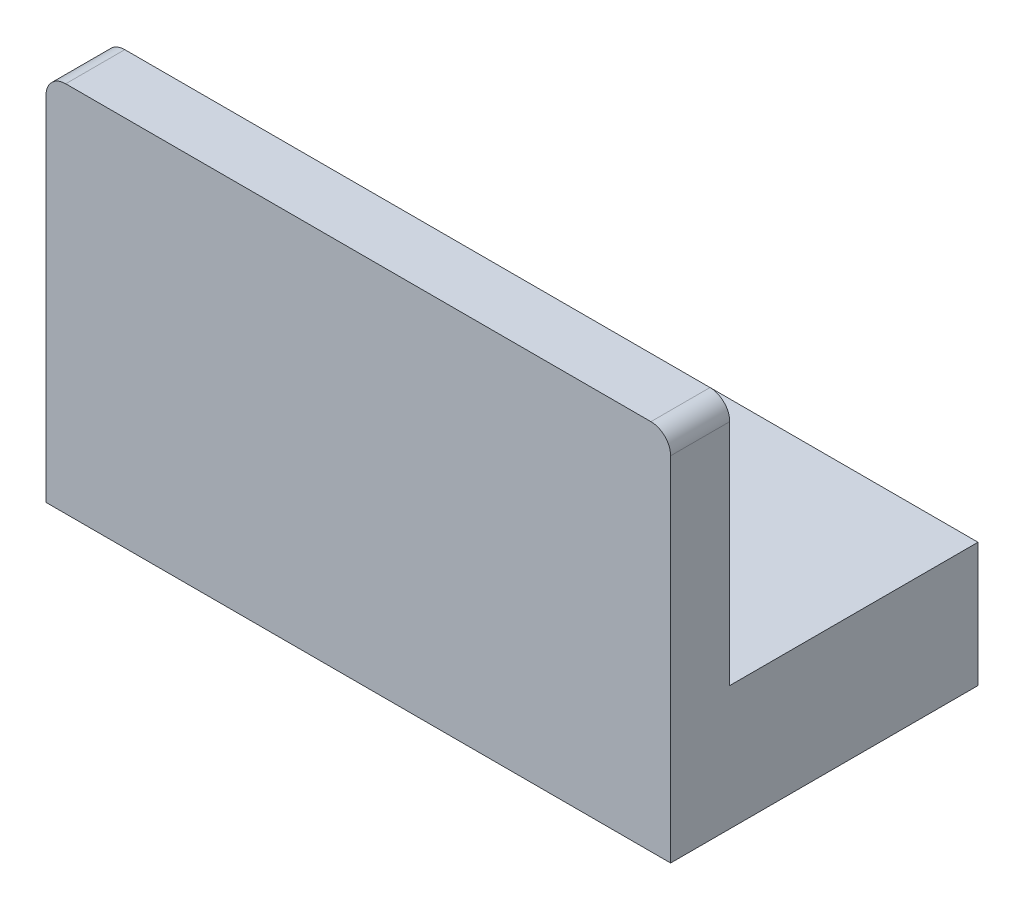
ISO-10303-21;
HEADER;
FILE_DESCRIPTION(('STEP AP214'),'2;1');
FILE_NAME('part.step','',(''),(''),'','','');
FILE_SCHEMA(('AUTOMOTIVE_DESIGN { 1 0 10303 214 1 1 1 1 }'));
ENDSEC;
DATA;
#1=APPLICATION_CONTEXT('core data for automotive mechanical design processes');
#2=APPLICATION_PROTOCOL_DEFINITION('international standard','automotive_design',2000,#1);
#3=PRODUCT_CONTEXT('',#1,'mechanical');
#4=PRODUCT('Part','Part','',(#3));
#5=PRODUCT_RELATED_PRODUCT_CATEGORY('part','',(#4));
#6=PRODUCT_DEFINITION_FORMATION('','',#4);
#7=PRODUCT_DEFINITION_CONTEXT('part definition',#1,'design');
#8=PRODUCT_DEFINITION('design','',#6,#7);
#9=PRODUCT_DEFINITION_SHAPE('','',#8);
#10=(LENGTH_UNIT() NAMED_UNIT(*) SI_UNIT(.MILLI.,.METRE.));
#11=(NAMED_UNIT(*) PLANE_ANGLE_UNIT() SI_UNIT($,.RADIAN.));
#12=(NAMED_UNIT(*) SI_UNIT($,.STERADIAN.) SOLID_ANGLE_UNIT());
#13=UNCERTAINTY_MEASURE_WITH_UNIT(LENGTH_MEASURE(1.E-05),#10,'distance_accuracy_value','');
#14=(GEOMETRIC_REPRESENTATION_CONTEXT(3) GLOBAL_UNCERTAINTY_ASSIGNED_CONTEXT((#13)) GLOBAL_UNIT_ASSIGNED_CONTEXT((#10,
#11,#12)) REPRESENTATION_CONTEXT('',''));
#15=CARTESIAN_POINT('',(0.,0.,0.));
#16=DIRECTION('',(0.,0.,1.));
#17=DIRECTION('',(1.,0.,0.));
#18=AXIS2_PLACEMENT_3D('',#15,#16,#17);
#19=CARTESIAN_POINT('',(-15.85,0.,0.));
#20=DIRECTION('',(0.,-1.,0.));
#21=DIRECTION('',(0.,0.,-1.));
#22=AXIS2_PLACEMENT_3D('',#19,#20,#21);
#23=PLANE('',#22);
#24=DIRECTION('',(0.,0.,-1.));
#25=VECTOR('',#24,1.);
#26=CARTESIAN_POINT('',(0.,0.,0.));
#27=LINE('',#26,#25);
#28=CARTESIAN_POINT('',(0.,0.,0.));
#29=VERTEX_POINT('',#28);
#30=CARTESIAN_POINT('',(0.,0.,-7.8));
#31=VERTEX_POINT('',#30);
#32=EDGE_CURVE('E181',#29,#31,#27,.T.);
#33=ORIENTED_EDGE('',*,*,#32,.F.);
#34=DIRECTION('',(1.,0.,0.));
#35=VECTOR('',#34,1.);
#36=CARTESIAN_POINT('',(-15.85,0.,0.));
#37=LINE('',#36,#35);
#38=CARTESIAN_POINT('',(-15.85,0.,0.));
#39=VERTEX_POINT('',#38);
#40=EDGE_CURVE('E179',#39,#29,#37,.T.);
#41=ORIENTED_EDGE('',*,*,#40,.F.);
#42=DIRECTION('',(0.,0.,-1.));
#43=VECTOR('',#42,1.);
#44=CARTESIAN_POINT('',(-15.85,0.,0.));
#45=LINE('',#44,#43);
#46=CARTESIAN_POINT('',(-15.85,0.,-7.8));
#47=VERTEX_POINT('',#46);
#48=EDGE_CURVE('E167',#39,#47,#45,.T.);
#49=ORIENTED_EDGE('',*,*,#48,.T.);
#50=DIRECTION('',(1.,0.,0.));
#51=VECTOR('',#50,1.);
#52=CARTESIAN_POINT('',(-15.85,0.,-7.8));
#53=LINE('',#52,#51);
#54=EDGE_CURVE('E201',#47,#31,#53,.T.);
#55=ORIENTED_EDGE('',*,*,#54,.T.);
#56=EDGE_LOOP('',(#33,#41,#49,#55));
#57=FACE_BOUND('',#56,.T.);
#58=DIRECTION('',(1.,0.,0.));
#59=VECTOR('',#58,1.);
#60=CARTESIAN_POINT('',(-15.85,0.,-1.55));
#61=LINE('',#60,#59);
#62=CARTESIAN_POINT('',(-14.3,0.,-1.55));
#63=VERTEX_POINT('',#62);
#64=CARTESIAN_POINT('',(-1.55,0.,-1.55));
#65=VERTEX_POINT('',#64);
#66=EDGE_CURVE('E136',#63,#65,#61,.T.);
#67=ORIENTED_EDGE('',*,*,#66,.T.);
#68=DIRECTION('',(0.,0.,-1.));
#69=VECTOR('',#68,1.);
#70=CARTESIAN_POINT('',(-1.55,0.,0.));
#71=LINE('',#70,#69);
#72=CARTESIAN_POINT('',(-1.55,0.,-6.25));
#73=VERTEX_POINT('',#72);
#74=EDGE_CURVE('E159',#65,#73,#71,.T.);
#75=ORIENTED_EDGE('',*,*,#74,.T.);
#76=DIRECTION('',(1.,0.,0.));
#77=VECTOR('',#76,1.);
#78=CARTESIAN_POINT('',(-15.85,0.,-6.25));
#79=LINE('',#78,#77);
#80=CARTESIAN_POINT('',(-14.3,0.,-6.25));
#81=VERTEX_POINT('',#80);
#82=EDGE_CURVE('E146',#81,#73,#79,.T.);
#83=ORIENTED_EDGE('',*,*,#82,.F.);
#84=DIRECTION('',(0.,0.,-1.));
#85=VECTOR('',#84,1.);
#86=CARTESIAN_POINT('',(-14.3,0.,0.));
#87=LINE('',#86,#85);
#88=EDGE_CURVE('E150',#63,#81,#87,.T.);
#89=ORIENTED_EDGE('',*,*,#88,.F.);
#90=EDGE_LOOP('',(#67,#75,#83,#89));
#91=FACE_BOUND('',#90,.T.);
#92=ADVANCED_FACE('F35',(#57,#91),#23,.T.);
#93=CARTESIAN_POINT('',(-15.85,9.45,0.));
#94=DIRECTION('',(0.,0.,1.));
#95=DIRECTION('',(1.,0.,0.));
#96=AXIS2_PLACEMENT_3D('',#93,#94,#95);
#97=PLANE('',#96);
#98=DIRECTION('',(0.,-1.,0.));
#99=VECTOR('',#98,1.);
#100=CARTESIAN_POINT('',(0.,9.45,0.));
#101=LINE('',#100,#99);
#102=CARTESIAN_POINT('',(0.,8.95,0.));
#103=VERTEX_POINT('',#102);
#104=EDGE_CURVE('E164',#103,#29,#101,.T.);
#105=ORIENTED_EDGE('',*,*,#104,.F.);
#106=CARTESIAN_POINT('',(-0.5,8.95,0.));
#107=DIRECTION('',(0.,0.,1.));
#108=DIRECTION('',(1.,0.,0.));
#109=AXIS2_PLACEMENT_3D('',#106,#107,#108);
#110=CIRCLE('',#109,0.5);
#111=CARTESIAN_POINT('',(-0.5,9.45,0.));
#112=VERTEX_POINT('',#111);
#113=EDGE_CURVE('E212',#103,#112,#110,.T.);
#114=ORIENTED_EDGE('',*,*,#113,.T.);
#115=DIRECTION('',(1.,0.,0.));
#116=VECTOR('',#115,1.);
#117=CARTESIAN_POINT('',(-15.85,9.45,0.));
#118=LINE('',#117,#116);
#119=CARTESIAN_POINT('',(-15.35,9.45,0.));
#120=VERTEX_POINT('',#119);
#121=EDGE_CURVE('E192',#120,#112,#118,.T.);
#122=ORIENTED_EDGE('',*,*,#121,.F.);
#123=CARTESIAN_POINT('',(-15.35,8.95,0.));
#124=DIRECTION('',(0.,0.,1.));
#125=DIRECTION('',(1.,0.,0.));
#126=AXIS2_PLACEMENT_3D('',#123,#124,#125);
#127=CIRCLE('',#126,0.5);
#128=CARTESIAN_POINT('',(-15.85,8.95,0.));
#129=VERTEX_POINT('',#128);
#130=EDGE_CURVE('E210',#120,#129,#127,.T.);
#131=ORIENTED_EDGE('',*,*,#130,.T.);
#132=DIRECTION('',(0.,-1.,0.));
#133=VECTOR('',#132,1.);
#134=CARTESIAN_POINT('',(-15.85,9.45,0.));
#135=LINE('',#134,#133);
#136=EDGE_CURVE('E165',#129,#39,#135,.T.);
#137=ORIENTED_EDGE('',*,*,#136,.T.);
#138=ORIENTED_EDGE('',*,*,#40,.T.);
#139=EDGE_LOOP('',(#105,#114,#122,#131,#137,#138));
#140=FACE_BOUND('',#139,.T.);
#141=ADVANCED_FACE('F232',(#140),#97,.T.);
#142=CARTESIAN_POINT('',(-15.85,9.45,-1.5));
#143=DIRECTION('',(0.,1.,0.));
#144=DIRECTION('',(0.,0.,1.));
#145=AXIS2_PLACEMENT_3D('',#142,#143,#144);
#146=PLANE('',#145);
#147=ORIENTED_EDGE('',*,*,#121,.T.);
#148=DIRECTION('',(0.,0.,1.));
#149=VECTOR('',#148,1.);
#150=CARTESIAN_POINT('',(-0.5,9.45,-1.5));
#151=LINE('',#150,#149);
#152=CARTESIAN_POINT('',(-0.5,9.45,-1.5));
#153=VERTEX_POINT('',#152);
#154=EDGE_CURVE('E56',#112,#153,#151,.F.);
#155=ORIENTED_EDGE('',*,*,#154,.T.);
#156=DIRECTION('',(1.,0.,0.));
#157=VECTOR('',#156,1.);
#158=CARTESIAN_POINT('',(-15.85,9.45,-1.5));
#159=LINE('',#158,#157);
#160=CARTESIAN_POINT('',(-15.35,9.45,-1.5));
#161=VERTEX_POINT('',#160);
#162=EDGE_CURVE('E195',#161,#153,#159,.T.);
#163=ORIENTED_EDGE('',*,*,#162,.F.);
#164=DIRECTION('',(0.,0.,1.));
#165=VECTOR('',#164,1.);
#166=CARTESIAN_POINT('',(-15.35,9.45,0.));
#167=LINE('',#166,#165);
#168=EDGE_CURVE('E214',#161,#120,#167,.T.);
#169=ORIENTED_EDGE('',*,*,#168,.T.);
#170=EDGE_LOOP('',(#147,#155,#163,#169));
#171=FACE_BOUND('',#170,.T.);
#172=ADVANCED_FACE('F233',(#171),#146,.T.);
#173=CARTESIAN_POINT('',(-15.85,3.15,-1.5));
#174=DIRECTION('',(0.,0.,-1.));
#175=DIRECTION('',(0.,1.,0.));
#176=AXIS2_PLACEMENT_3D('',#173,#174,#175);
#177=PLANE('',#176);
#178=ORIENTED_EDGE('',*,*,#162,.T.);
#179=CARTESIAN_POINT('',(-0.5,8.95,-1.5));
#180=DIRECTION('',(0.,0.,-1.));
#181=DIRECTION('',(0.,1.,0.));
#182=AXIS2_PLACEMENT_3D('',#179,#180,#181);
#183=CIRCLE('',#182,0.5);
#184=CARTESIAN_POINT('',(0.,8.95,-1.5));
#185=VERTEX_POINT('',#184);
#186=EDGE_CURVE('E43',#153,#185,#183,.T.);
#187=ORIENTED_EDGE('',*,*,#186,.T.);
#188=DIRECTION('',(0.,1.,0.));
#189=VECTOR('',#188,1.);
#190=CARTESIAN_POINT('',(0.,3.15,-1.5));
#191=LINE('',#190,#189);
#192=CARTESIAN_POINT('',(0.,3.15,-1.5));
#193=VERTEX_POINT('',#192);
#194=EDGE_CURVE('E168',#193,#185,#191,.T.);
#195=ORIENTED_EDGE('',*,*,#194,.F.);
#196=DIRECTION('',(1.,0.,0.));
#197=VECTOR('',#196,1.);
#198=CARTESIAN_POINT('',(-15.85,3.15,-1.5));
#199=LINE('',#198,#197);
#200=CARTESIAN_POINT('',(-15.85,3.15,-1.5));
#201=VERTEX_POINT('',#200);
#202=EDGE_CURVE('E197',#201,#193,#199,.T.);
#203=ORIENTED_EDGE('',*,*,#202,.F.);
#204=DIRECTION('',(0.,1.,0.));
#205=VECTOR('',#204,1.);
#206=CARTESIAN_POINT('',(-15.85,3.15,-1.5));
#207=LINE('',#206,#205);
#208=CARTESIAN_POINT('',(-15.85,8.95,-1.5));
#209=VERTEX_POINT('',#208);
#210=EDGE_CURVE('E177',#201,#209,#207,.T.);
#211=ORIENTED_EDGE('',*,*,#210,.T.);
#212=CARTESIAN_POINT('',(-15.35,8.95,-1.5));
#213=DIRECTION('',(0.,0.,-1.));
#214=DIRECTION('',(0.,1.,0.));
#215=AXIS2_PLACEMENT_3D('',#212,#213,#214);
#216=CIRCLE('',#215,0.5);
#217=EDGE_CURVE('E218',#209,#161,#216,.T.);
#218=ORIENTED_EDGE('',*,*,#217,.T.);
#219=EDGE_LOOP('',(#178,#187,#195,#203,#211,#218));
#220=FACE_BOUND('',#219,.T.);
#221=ADVANCED_FACE('F222',(#220),#177,.T.);
#222=CARTESIAN_POINT('',(-15.85,3.15,-7.8));
#223=DIRECTION('',(0.,1.,0.));
#224=DIRECTION('',(0.,0.,1.));
#225=AXIS2_PLACEMENT_3D('',#222,#223,#224);
#226=PLANE('',#225);
#227=DIRECTION('',(0.,0.,1.));
#228=VECTOR('',#227,1.);
#229=CARTESIAN_POINT('',(0.,3.15,-7.8));
#230=LINE('',#229,#228);
#231=CARTESIAN_POINT('',(0.,3.15,-7.8));
#232=VERTEX_POINT('',#231);
#233=EDGE_CURVE('E187',#232,#193,#230,.T.);
#234=ORIENTED_EDGE('',*,*,#233,.F.);
#235=DIRECTION('',(1.,0.,0.));
#236=VECTOR('',#235,1.);
#237=CARTESIAN_POINT('',(-15.85,3.15,-7.8));
#238=LINE('',#237,#236);
#239=CARTESIAN_POINT('',(-15.85,3.15,-7.8));
#240=VERTEX_POINT('',#239);
#241=EDGE_CURVE('E199',#240,#232,#238,.T.);
#242=ORIENTED_EDGE('',*,*,#241,.F.);
#243=DIRECTION('',(0.,0.,1.));
#244=VECTOR('',#243,1.);
#245=CARTESIAN_POINT('',(-15.85,3.15,-7.8));
#246=LINE('',#245,#244);
#247=EDGE_CURVE('E174',#240,#201,#246,.T.);
#248=ORIENTED_EDGE('',*,*,#247,.T.);
#249=ORIENTED_EDGE('',*,*,#202,.T.);
#250=EDGE_LOOP('',(#234,#242,#248,#249));
#251=FACE_BOUND('',#250,.T.);
#252=ADVANCED_FACE('F249',(#251),#226,.T.);
#253=CARTESIAN_POINT('',(-15.85,0.,-7.8));
#254=DIRECTION('',(0.,0.,-1.));
#255=DIRECTION('',(0.,1.,0.));
#256=AXIS2_PLACEMENT_3D('',#253,#254,#255);
#257=PLANE('',#256);
#258=DIRECTION('',(0.,1.,0.));
#259=VECTOR('',#258,1.);
#260=CARTESIAN_POINT('',(0.,0.,-7.8));
#261=LINE('',#260,#259);
#262=EDGE_CURVE('E184',#31,#232,#261,.T.);
#263=ORIENTED_EDGE('',*,*,#262,.F.);
#264=ORIENTED_EDGE('',*,*,#54,.F.);
#265=DIRECTION('',(0.,1.,0.));
#266=VECTOR('',#265,1.);
#267=CARTESIAN_POINT('',(-15.85,0.,-7.8));
#268=LINE('',#267,#266);
#269=EDGE_CURVE('E171',#47,#240,#268,.T.);
#270=ORIENTED_EDGE('',*,*,#269,.T.);
#271=ORIENTED_EDGE('',*,*,#241,.T.);
#272=EDGE_LOOP('',(#263,#264,#270,#271));
#273=FACE_BOUND('',#272,.T.);
#274=ADVANCED_FACE('F247',(#273),#257,.T.);
#275=CARTESIAN_POINT('',(-15.85,0.,0.));
#276=DIRECTION('',(1.,0.,0.));
#277=DIRECTION('',(0.,0.,-1.));
#278=AXIS2_PLACEMENT_3D('',#275,#276,#277);
#279=PLANE('',#278);
#280=ORIENTED_EDGE('',*,*,#136,.F.);
#281=DIRECTION('',(0.,0.,1.));
#282=VECTOR('',#281,1.);
#283=CARTESIAN_POINT('',(-15.85,8.95,-1.5));
#284=LINE('',#283,#282);
#285=EDGE_CURVE('E12',#129,#209,#284,.F.);
#286=ORIENTED_EDGE('',*,*,#285,.T.);
#287=ORIENTED_EDGE('',*,*,#210,.F.);
#288=ORIENTED_EDGE('',*,*,#247,.F.);
#289=ORIENTED_EDGE('',*,*,#269,.F.);
#290=ORIENTED_EDGE('',*,*,#48,.F.);
#291=EDGE_LOOP('',(#280,#286,#287,#288,#289,#290));
#292=FACE_BOUND('',#291,.T.);
#293=ADVANCED_FACE('F239',(#292),#279,.F.);
#294=CARTESIAN_POINT('',(0.,0.,0.));
#295=DIRECTION('',(1.,0.,0.));
#296=DIRECTION('',(0.,0.,-1.));
#297=AXIS2_PLACEMENT_3D('',#294,#295,#296);
#298=PLANE('',#297);
#299=ORIENTED_EDGE('',*,*,#194,.T.);
#300=DIRECTION('',(0.,0.,1.));
#301=VECTOR('',#300,1.);
#302=CARTESIAN_POINT('',(0.,8.95,0.));
#303=LINE('',#302,#301);
#304=EDGE_CURVE('E207',#185,#103,#303,.T.);
#305=ORIENTED_EDGE('',*,*,#304,.T.);
#306=ORIENTED_EDGE('',*,*,#104,.T.);
#307=ORIENTED_EDGE('',*,*,#32,.T.);
#308=ORIENTED_EDGE('',*,*,#262,.T.);
#309=ORIENTED_EDGE('',*,*,#233,.T.);
#310=EDGE_LOOP('',(#299,#305,#306,#307,#308,#309));
#311=FACE_BOUND('',#310,.T.);
#312=ADVANCED_FACE('F226',(#311),#298,.T.);
#313=CARTESIAN_POINT('',(-15.85,9.45,-1.55));
#314=DIRECTION('',(0.,0.,1.));
#315=DIRECTION('',(1.,0.,0.));
#316=AXIS2_PLACEMENT_3D('',#313,#314,#315);
#317=PLANE('',#316);
#318=DIRECTION('',(0.,-1.,0.));
#319=VECTOR('',#318,1.);
#320=CARTESIAN_POINT('',(-1.55,0.,-1.55));
#321=LINE('',#320,#319);
#322=CARTESIAN_POINT('',(-1.55,1.6,-1.55));
#323=VERTEX_POINT('',#322);
#324=EDGE_CURVE('E162',#323,#65,#321,.T.);
#325=ORIENTED_EDGE('',*,*,#324,.T.);
#326=ORIENTED_EDGE('',*,*,#66,.F.);
#327=DIRECTION('',(0.,-1.,0.));
#328=VECTOR('',#327,1.);
#329=CARTESIAN_POINT('',(-14.3,0.,-1.55));
#330=LINE('',#329,#328);
#331=CARTESIAN_POINT('',(-14.3,1.6,-1.55));
#332=VERTEX_POINT('',#331);
#333=EDGE_CURVE('E152',#332,#63,#330,.T.);
#334=ORIENTED_EDGE('',*,*,#333,.F.);
#335=DIRECTION('',(-1.,0.,0.));
#336=VECTOR('',#335,1.);
#337=CARTESIAN_POINT('',(-15.85,1.6,-1.55));
#338=LINE('',#337,#336);
#339=EDGE_CURVE('E131',#323,#332,#338,.T.);
#340=ORIENTED_EDGE('',*,*,#339,.F.);
#341=EDGE_LOOP('',(#325,#326,#334,#340));
#342=FACE_BOUND('',#341,.T.);
#343=ADVANCED_FACE('F283',(#342),#317,.F.);
#344=CARTESIAN_POINT('',(-15.85,1.6,-7.8));
#345=DIRECTION('',(0.,1.,0.));
#346=DIRECTION('',(0.,0.,1.));
#347=AXIS2_PLACEMENT_3D('',#344,#345,#346);
#348=PLANE('',#347);
#349=CARTESIAN_POINT('',(-7.925,1.6,-3.9));
#350=DIRECTION('',(0.,1.,0.));
#351=DIRECTION('',(0.,0.,1.));
#352=AXIS2_PLACEMENT_3D('',#349,#350,#351);
#353=CIRCLE('',#352,1.5);
#354=CARTESIAN_POINT('',(-7.925,1.6,-2.4));
#355=VERTEX_POINT('',#354);
#356=EDGE_CURVE('E194',#355,#355,#353,.F.);
#357=ORIENTED_EDGE('',*,*,#356,.F.);
#358=EDGE_LOOP('',(#357));
#359=FACE_BOUND('',#358,.T.);
#360=ORIENTED_EDGE('',*,*,#339,.T.);
#361=DIRECTION('',(0.,0.,1.));
#362=VECTOR('',#361,1.);
#363=CARTESIAN_POINT('',(-14.3,1.6,0.));
#364=LINE('',#363,#362);
#365=CARTESIAN_POINT('',(-14.3,1.6,-6.25));
#366=VERTEX_POINT('',#365);
#367=EDGE_CURVE('E125',#366,#332,#364,.T.);
#368=ORIENTED_EDGE('',*,*,#367,.F.);
#369=DIRECTION('',(1.,0.,0.));
#370=VECTOR('',#369,1.);
#371=CARTESIAN_POINT('',(-15.85,1.6,-6.25));
#372=LINE('',#371,#370);
#373=CARTESIAN_POINT('',(-1.55,1.6,-6.25));
#374=VERTEX_POINT('',#373);
#375=EDGE_CURVE('E129',#366,#374,#372,.T.);
#376=ORIENTED_EDGE('',*,*,#375,.T.);
#377=DIRECTION('',(0.,0.,1.));
#378=VECTOR('',#377,1.);
#379=CARTESIAN_POINT('',(-1.55,1.6,0.));
#380=LINE('',#379,#378);
#381=EDGE_CURVE('E310',#374,#323,#380,.T.);
#382=ORIENTED_EDGE('',*,*,#381,.T.);
#383=EDGE_LOOP('',(#360,#368,#376,#382));
#384=FACE_BOUND('',#383,.T.);
#385=ADVANCED_FACE('F127',(#359,#384),#348,.F.);
#386=CARTESIAN_POINT('',(-15.85,0.,-6.25));
#387=DIRECTION('',(0.,0.,-1.));
#388=DIRECTION('',(0.,1.,0.));
#389=AXIS2_PLACEMENT_3D('',#386,#387,#388);
#390=PLANE('',#389);
#391=DIRECTION('',(0.,1.,0.));
#392=VECTOR('',#391,1.);
#393=CARTESIAN_POINT('',(-1.55,0.,-6.25));
#394=LINE('',#393,#392);
#395=EDGE_CURVE('E145',#73,#374,#394,.T.);
#396=ORIENTED_EDGE('',*,*,#395,.T.);
#397=ORIENTED_EDGE('',*,*,#375,.F.);
#398=DIRECTION('',(0.,1.,0.));
#399=VECTOR('',#398,1.);
#400=CARTESIAN_POINT('',(-14.3,0.,-6.25));
#401=LINE('',#400,#399);
#402=EDGE_CURVE('E137',#81,#366,#401,.T.);
#403=ORIENTED_EDGE('',*,*,#402,.F.);
#404=ORIENTED_EDGE('',*,*,#82,.T.);
#405=EDGE_LOOP('',(#396,#397,#403,#404));
#406=FACE_BOUND('',#405,.T.);
#407=ADVANCED_FACE('F142',(#406),#390,.F.);
#408=CARTESIAN_POINT('',(-14.3,0.,0.));
#409=DIRECTION('',(1.,0.,0.));
#410=DIRECTION('',(0.,0.,-1.));
#411=AXIS2_PLACEMENT_3D('',#408,#409,#410);
#412=PLANE('',#411);
#413=ORIENTED_EDGE('',*,*,#333,.T.);
#414=ORIENTED_EDGE('',*,*,#88,.T.);
#415=ORIENTED_EDGE('',*,*,#402,.T.);
#416=ORIENTED_EDGE('',*,*,#367,.T.);
#417=EDGE_LOOP('',(#413,#414,#415,#416));
#418=FACE_BOUND('',#417,.T.);
#419=ADVANCED_FACE('F148',(#418),#412,.T.);
#420=CARTESIAN_POINT('',(-1.55,0.,0.));
#421=DIRECTION('',(1.,0.,0.));
#422=DIRECTION('',(0.,0.,-1.));
#423=AXIS2_PLACEMENT_3D('',#420,#421,#422);
#424=PLANE('',#423);
#425=ORIENTED_EDGE('',*,*,#381,.F.);
#426=ORIENTED_EDGE('',*,*,#395,.F.);
#427=ORIENTED_EDGE('',*,*,#74,.F.);
#428=ORIENTED_EDGE('',*,*,#324,.F.);
#429=EDGE_LOOP('',(#425,#426,#427,#428));
#430=FACE_BOUND('',#429,.T.);
#431=ADVANCED_FACE('F295',(#430),#424,.F.);
#432=CARTESIAN_POINT('',(-7.925,-4.24264068711928,-3.9));
#433=DIRECTION('',(0.,1.,0.));
#434=DIRECTION('',(0.,0.,1.));
#435=AXIS2_PLACEMENT_3D('',#432,#433,#434);
#436=CYLINDRICAL_SURFACE('',#435,1.5);
#437=ORIENTED_EDGE('',*,*,#356,.T.);
#438=EDGE_LOOP('',(#437));
#439=FACE_BOUND('',#438,.T.);
#440=CARTESIAN_POINT('',(-7.925,0.2,-3.9));
#441=DIRECTION('',(0.,-1.,0.));
#442=DIRECTION('',(0.,0.,-1.));
#443=AXIS2_PLACEMENT_3D('',#440,#441,#442);
#444=CIRCLE('',#443,1.5);
#445=CARTESIAN_POINT('',(-7.925,0.2,-5.4));
#446=VERTEX_POINT('',#445);
#447=EDGE_CURVE('E299',#446,#446,#444,.T.);
#448=ORIENTED_EDGE('',*,*,#447,.F.);
#449=EDGE_LOOP('',(#448));
#450=FACE_BOUND('',#449,.T.);
#451=ADVANCED_FACE('F292',(#439,#450),#436,.T.);
#452=CARTESIAN_POINT('',(-7.925,-4.24264068711928,-3.9));
#453=DIRECTION('',(0.,1.,0.));
#454=DIRECTION('',(0.,0.,1.));
#455=AXIS2_PLACEMENT_3D('',#452,#453,#454);
#456=CYLINDRICAL_SURFACE('',#455,0.7);
#457=CARTESIAN_POINT('',(-7.925,1.6,-3.9));
#458=DIRECTION('',(0.,-1.,0.));
#459=DIRECTION('',(0.,0.,-1.));
#460=AXIS2_PLACEMENT_3D('',#457,#458,#459);
#461=CIRCLE('',#460,0.7);
#462=CARTESIAN_POINT('',(-7.925,1.6,-4.6));
#463=VERTEX_POINT('',#462);
#464=EDGE_CURVE('E301',#463,#463,#461,.T.);
#465=ORIENTED_EDGE('',*,*,#464,.F.);
#466=EDGE_LOOP('',(#465));
#467=FACE_BOUND('',#466,.T.);
#468=CARTESIAN_POINT('',(-7.925,0.2,-3.9));
#469=DIRECTION('',(0.,-1.,0.));
#470=DIRECTION('',(0.,0.,-1.));
#471=AXIS2_PLACEMENT_3D('',#468,#469,#470);
#472=CIRCLE('',#471,0.7);
#473=CARTESIAN_POINT('',(-7.925,0.2,-4.6));
#474=VERTEX_POINT('',#473);
#475=EDGE_CURVE('E304',#474,#474,#472,.T.);
#476=ORIENTED_EDGE('',*,*,#475,.T.);
#477=EDGE_LOOP('',(#476));
#478=FACE_BOUND('',#477,.T.);
#479=ADVANCED_FACE('F276',(#467,#478),#456,.F.);
#480=CARTESIAN_POINT('',(-15.85,0.2,0.));
#481=DIRECTION('',(0.,-1.,0.));
#482=DIRECTION('',(0.,0.,-1.));
#483=AXIS2_PLACEMENT_3D('',#480,#481,#482);
#484=PLANE('',#483);
#485=ORIENTED_EDGE('',*,*,#475,.F.);
#486=EDGE_LOOP('',(#485));
#487=FACE_BOUND('',#486,.T.);
#488=ORIENTED_EDGE('',*,*,#447,.T.);
#489=EDGE_LOOP('',(#488));
#490=FACE_BOUND('',#489,.T.);
#491=ADVANCED_FACE('F270',(#487,#490),#484,.T.);
#492=ORIENTED_EDGE('',*,*,#464,.T.);
#493=EDGE_LOOP('',(#492));
#494=FACE_BOUND('',#493,.T.);
#495=ADVANCED_FACE('F265',(#494),#348,.F.);
#496=CARTESIAN_POINT('',(-0.5,8.95,0.));
#497=DIRECTION('',(0.,0.,1.));
#498=DIRECTION('',(1.,0.,0.));
#499=AXIS2_PLACEMENT_3D('',#496,#497,#498);
#500=CYLINDRICAL_SURFACE('',#499,0.5);
#501=ORIENTED_EDGE('',*,*,#186,.F.);
#502=ORIENTED_EDGE('',*,*,#154,.F.);
#503=ORIENTED_EDGE('',*,*,#113,.F.);
#504=ORIENTED_EDGE('',*,*,#304,.F.);
#505=EDGE_LOOP('',(#501,#502,#503,#504));
#506=FACE_BOUND('',#505,.T.);
#507=ADVANCED_FACE('F229',(#506),#500,.T.);
#508=CARTESIAN_POINT('',(-15.35,8.95,-1.5));
#509=DIRECTION('',(0.,0.,-1.));
#510=DIRECTION('',(-1.,0.,0.));
#511=AXIS2_PLACEMENT_3D('',#508,#509,#510);
#512=CYLINDRICAL_SURFACE('',#511,0.5);
#513=ORIENTED_EDGE('',*,*,#217,.F.);
#514=ORIENTED_EDGE('',*,*,#285,.F.);
#515=ORIENTED_EDGE('',*,*,#130,.F.);
#516=ORIENTED_EDGE('',*,*,#168,.F.);
#517=EDGE_LOOP('',(#513,#514,#515,#516));
#518=FACE_BOUND('',#517,.T.);
#519=ADVANCED_FACE('F37',(#518),#512,.T.);
#520=CLOSED_SHELL('',(#92,#141,#172,#221,#252,#274,#293,#312,#343,#385,#407,#419,#431,#451,#479,
#491,#495,#507,#519));
#521=MANIFOLD_SOLID_BREP('B2',#520);
#522=ADVANCED_BREP_SHAPE_REPRESENTATION('',(#18,#521),#14);
#523=SHAPE_DEFINITION_REPRESENTATION(#9,#522);
ENDSEC;
END-ISO-10303-21;
